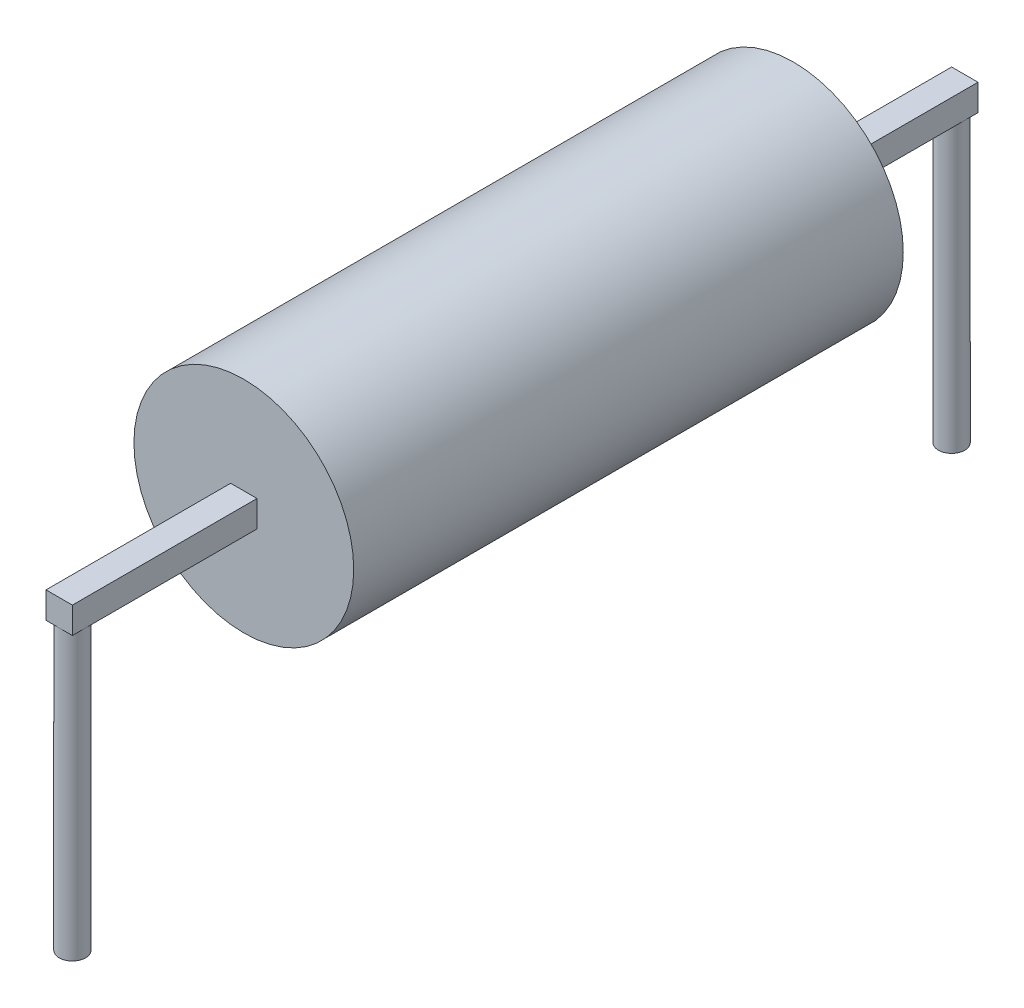
ISO-10303-21;
HEADER;
FILE_DESCRIPTION(('STEP AP214'),'2;1');
FILE_NAME('part.step','',(''),(''),'','','');
FILE_SCHEMA(('AUTOMOTIVE_DESIGN { 1 0 10303 214 1 1 1 1 }'));
ENDSEC;
DATA;
#1=APPLICATION_CONTEXT('core data for automotive mechanical design processes');
#2=APPLICATION_PROTOCOL_DEFINITION('international standard','automotive_design',2000,#1);
#3=PRODUCT_CONTEXT('',#1,'mechanical');
#4=PRODUCT('Part','Part','',(#3));
#5=PRODUCT_RELATED_PRODUCT_CATEGORY('part','',(#4));
#6=PRODUCT_DEFINITION_FORMATION('','',#4);
#7=PRODUCT_DEFINITION_CONTEXT('part definition',#1,'design');
#8=PRODUCT_DEFINITION('design','',#6,#7);
#9=PRODUCT_DEFINITION_SHAPE('','',#8);
#10=(LENGTH_UNIT() NAMED_UNIT(*) SI_UNIT(.MILLI.,.METRE.));
#11=(NAMED_UNIT(*) PLANE_ANGLE_UNIT() SI_UNIT($,.RADIAN.));
#12=(NAMED_UNIT(*) SI_UNIT($,.STERADIAN.) SOLID_ANGLE_UNIT());
#13=UNCERTAINTY_MEASURE_WITH_UNIT(LENGTH_MEASURE(1.E-05),#10,'distance_accuracy_value','');
#14=(GEOMETRIC_REPRESENTATION_CONTEXT(3) GLOBAL_UNCERTAINTY_ASSIGNED_CONTEXT((#13)) GLOBAL_UNIT_ASSIGNED_CONTEXT((#10,
#11,#12)) REPRESENTATION_CONTEXT('',''));
#15=CARTESIAN_POINT('',(0.,0.,0.));
#16=DIRECTION('',(0.,0.,1.));
#17=DIRECTION('',(1.,0.,0.));
#18=AXIS2_PLACEMENT_3D('',#15,#16,#17);
#19=CARTESIAN_POINT('',(-0.299999999999995,-0.3,16.7));
#20=DIRECTION('',(0.,1.,0.));
#21=DIRECTION('',(-1.,0.,0.));
#22=AXIS2_PLACEMENT_3D('',#19,#20,#21);
#23=PLANE('',#22);
#24=CARTESIAN_POINT('',(0.,-0.3,-3.59999999999999));
#25=DIRECTION('',(0.,-1.,0.));
#26=DIRECTION('',(1.,0.,0.));
#27=AXIS2_PLACEMENT_3D('',#24,#25,#26);
#28=CIRCLE('',#27,0.3);
#29=CARTESIAN_POINT('',(-0.299999999999995,-0.3,-3.59999999999999));
#30=VERTEX_POINT('',#29);
#31=CARTESIAN_POINT('',(0.,-0.3,-3.89999999999999));
#32=VERTEX_POINT('',#31);
#33=EDGE_CURVE('E129',#30,#32,#28,.T.);
#34=ORIENTED_EDGE('',*,*,#33,.F.);
#35=DIRECTION('',(0.,0.,-1.));
#36=VECTOR('',#35,1.);
#37=CARTESIAN_POINT('',(-0.299999999999995,-0.3,16.7));
#38=LINE('',#37,#36);
#39=CARTESIAN_POINT('',(-0.299999999999995,-0.3,-3.89999999999999));
#40=VERTEX_POINT('',#39);
#41=EDGE_CURVE('E116',#30,#40,#38,.T.);
#42=ORIENTED_EDGE('',*,*,#41,.T.);
#43=DIRECTION('',(1.,0.,0.));
#44=VECTOR('',#43,1.);
#45=CARTESIAN_POINT('',(-0.299999999999995,-0.3,-3.89999999999999));
#46=LINE('',#45,#44);
#47=EDGE_CURVE('E130',#40,#32,#46,.T.);
#48=ORIENTED_EDGE('',*,*,#47,.T.);
#49=EDGE_LOOP('',(#34,#42,#48));
#50=FACE_BOUND('',#49,.T.);
#51=ADVANCED_FACE('F28',(#50),#23,.F.);
#52=CARTESIAN_POINT('',(0.299999999999995,-0.3,-3.59999999999999));
#53=VERTEX_POINT('',#52);
#54=EDGE_CURVE('E43',#32,#53,#28,.T.);
#55=ORIENTED_EDGE('',*,*,#54,.F.);
#56=CARTESIAN_POINT('',(0.299999999999995,-0.3,-3.89999999999999));
#57=VERTEX_POINT('',#56);
#58=EDGE_CURVE('E147',#32,#57,#46,.T.);
#59=ORIENTED_EDGE('',*,*,#58,.T.);
#60=DIRECTION('',(0.,0.,-1.));
#61=VECTOR('',#60,1.);
#62=CARTESIAN_POINT('',(0.299999999999995,-0.3,16.7));
#63=LINE('',#62,#61);
#64=EDGE_CURVE('E173',#53,#57,#63,.T.);
#65=ORIENTED_EDGE('',*,*,#64,.F.);
#66=EDGE_LOOP('',(#55,#59,#65));
#67=FACE_BOUND('',#66,.T.);
#68=ADVANCED_FACE('F229',(#67),#23,.F.);
#69=EDGE_CURVE('E51',#53,#30,#28,.T.);
#70=ORIENTED_EDGE('',*,*,#69,.F.);
#71=CARTESIAN_POINT('',(0.299999999999995,-0.3,0.));
#72=VERTEX_POINT('',#71);
#73=EDGE_CURVE('E176',#72,#53,#63,.T.);
#74=ORIENTED_EDGE('',*,*,#73,.F.);
#75=DIRECTION('',(-1.,0.,0.));
#76=VECTOR('',#75,1.);
#77=CARTESIAN_POINT('',(0.,-0.3,0.));
#78=LINE('',#77,#76);
#79=CARTESIAN_POINT('',(-0.299999999999995,-0.3,0.));
#80=VERTEX_POINT('',#79);
#81=EDGE_CURVE('E36',#72,#80,#78,.T.);
#82=ORIENTED_EDGE('',*,*,#81,.T.);
#83=EDGE_CURVE('E111',#80,#30,#38,.T.);
#84=ORIENTED_EDGE('',*,*,#83,.T.);
#85=EDGE_LOOP('',(#70,#74,#82,#84));
#86=FACE_BOUND('',#85,.T.);
#87=ADVANCED_FACE('F113',(#86),#23,.F.);
#88=CARTESIAN_POINT('',(0.,-0.3,16.4));
#89=DIRECTION('',(0.,-1.,0.));
#90=DIRECTION('',(1.,0.,0.));
#91=AXIS2_PLACEMENT_3D('',#88,#89,#90);
#92=CIRCLE('',#91,0.3);
#93=CARTESIAN_POINT('',(-0.299999999999995,-0.3,16.4));
#94=VERTEX_POINT('',#93);
#95=CARTESIAN_POINT('',(0.299999999999995,-0.3,16.4));
#96=VERTEX_POINT('',#95);
#97=EDGE_CURVE('E136',#94,#96,#92,.T.);
#98=ORIENTED_EDGE('',*,*,#97,.F.);
#99=CARTESIAN_POINT('',(-0.299999999999995,-0.3,12.5));
#100=VERTEX_POINT('',#99);
#101=EDGE_CURVE('E115',#94,#100,#38,.T.);
#102=ORIENTED_EDGE('',*,*,#101,.T.);
#103=DIRECTION('',(-1.,0.,0.));
#104=VECTOR('',#103,1.);
#105=CARTESIAN_POINT('',(0.,-0.3,12.5));
#106=LINE('',#105,#104);
#107=CARTESIAN_POINT('',(0.299999999999995,-0.3,12.5));
#108=VERTEX_POINT('',#107);
#109=EDGE_CURVE('E184',#108,#100,#106,.T.);
#110=ORIENTED_EDGE('',*,*,#109,.F.);
#111=EDGE_CURVE('E175',#96,#108,#63,.T.);
#112=ORIENTED_EDGE('',*,*,#111,.F.);
#113=EDGE_LOOP('',(#98,#102,#110,#112));
#114=FACE_BOUND('',#113,.T.);
#115=ADVANCED_FACE('F231',(#114),#23,.F.);
#116=CARTESIAN_POINT('',(0.,-0.3,16.7));
#117=VERTEX_POINT('',#116);
#118=EDGE_CURVE('E139',#96,#117,#92,.T.);
#119=ORIENTED_EDGE('',*,*,#118,.F.);
#120=CARTESIAN_POINT('',(0.299999999999995,-0.3,16.7));
#121=VERTEX_POINT('',#120);
#122=EDGE_CURVE('E127',#121,#96,#63,.T.);
#123=ORIENTED_EDGE('',*,*,#122,.F.);
#124=DIRECTION('',(1.,0.,0.));
#125=VECTOR('',#124,1.);
#126=CARTESIAN_POINT('',(-0.299999999999995,-0.3,16.7));
#127=LINE('',#126,#125);
#128=EDGE_CURVE('E158',#117,#121,#127,.T.);
#129=ORIENTED_EDGE('',*,*,#128,.F.);
#130=EDGE_LOOP('',(#119,#123,#129));
#131=FACE_BOUND('',#130,.T.);
#132=ADVANCED_FACE('F237',(#131),#23,.F.);
#133=EDGE_CURVE('E143',#117,#94,#92,.T.);
#134=ORIENTED_EDGE('',*,*,#133,.F.);
#135=CARTESIAN_POINT('',(-0.299999999999995,-0.3,16.7));
#136=VERTEX_POINT('',#135);
#137=EDGE_CURVE('E159',#136,#117,#127,.T.);
#138=ORIENTED_EDGE('',*,*,#137,.F.);
#139=EDGE_CURVE('E118',#136,#94,#38,.T.);
#140=ORIENTED_EDGE('',*,*,#139,.T.);
#141=EDGE_LOOP('',(#134,#138,#140));
#142=FACE_BOUND('',#141,.T.);
#143=ADVANCED_FACE('F224',(#142),#23,.F.);
#144=CARTESIAN_POINT('',(0.,0.,12.5));
#145=DIRECTION('',(0.,0.,1.));
#146=DIRECTION('',(1.,0.,0.));
#147=AXIS2_PLACEMENT_3D('',#144,#145,#146);
#148=PLANE('',#147);
#149=CARTESIAN_POINT('',(0.,0.,12.5));
#150=DIRECTION('',(0.,0.,1.));
#151=DIRECTION('',(1.,0.,0.));
#152=AXIS2_PLACEMENT_3D('',#149,#150,#151);
#153=CIRCLE('',#152,2.5);
#154=CARTESIAN_POINT('',(2.5,0.,12.5));
#155=VERTEX_POINT('',#154);
#156=EDGE_CURVE('E193',#155,#155,#153,.T.);
#157=ORIENTED_EDGE('',*,*,#156,.T.);
#158=EDGE_LOOP('',(#157));
#159=FACE_BOUND('',#158,.T.);
#160=ORIENTED_EDGE('',*,*,#109,.T.);
#161=DIRECTION('',(0.,1.,0.));
#162=VECTOR('',#161,1.);
#163=CARTESIAN_POINT('',(-0.299999999999995,0.,12.5));
#164=LINE('',#163,#162);
#165=CARTESIAN_POINT('',(-0.299999999999995,0.3,12.5));
#166=VERTEX_POINT('',#165);
#167=EDGE_CURVE('E187',#100,#166,#164,.T.);
#168=ORIENTED_EDGE('',*,*,#167,.T.);
#169=DIRECTION('',(1.,0.,0.));
#170=VECTOR('',#169,1.);
#171=CARTESIAN_POINT('',(0.,0.3,12.5));
#172=LINE('',#171,#170);
#173=CARTESIAN_POINT('',(0.299999999999995,0.3,12.5));
#174=VERTEX_POINT('',#173);
#175=EDGE_CURVE('E178',#166,#174,#172,.T.);
#176=ORIENTED_EDGE('',*,*,#175,.T.);
#177=DIRECTION('',(0.,-1.,0.));
#178=VECTOR('',#177,1.);
#179=CARTESIAN_POINT('',(0.299999999999995,0.,12.5));
#180=LINE('',#179,#178);
#181=EDGE_CURVE('E181',#174,#108,#180,.T.);
#182=ORIENTED_EDGE('',*,*,#181,.T.);
#183=EDGE_LOOP('',(#160,#168,#176,#182));
#184=FACE_BOUND('',#183,.T.);
#185=ADVANCED_FACE('F216',(#159,#184),#148,.T.);
#186=CARTESIAN_POINT('',(0.,0.,0.));
#187=DIRECTION('',(0.,0.,1.));
#188=DIRECTION('',(1.,0.,0.));
#189=AXIS2_PLACEMENT_3D('',#186,#187,#188);
#190=PLANE('',#189);
#191=CARTESIAN_POINT('',(0.,0.,0.));
#192=DIRECTION('',(0.,0.,1.));
#193=DIRECTION('',(1.,0.,0.));
#194=AXIS2_PLACEMENT_3D('',#191,#192,#193);
#195=CIRCLE('',#194,2.5);
#196=CARTESIAN_POINT('',(2.5,0.,0.));
#197=VERTEX_POINT('',#196);
#198=EDGE_CURVE('E190',#197,#197,#195,.T.);
#199=ORIENTED_EDGE('',*,*,#198,.F.);
#200=EDGE_LOOP('',(#199));
#201=FACE_BOUND('',#200,.T.);
#202=DIRECTION('',(0.,1.,0.));
#203=VECTOR('',#202,1.);
#204=CARTESIAN_POINT('',(-0.299999999999995,0.,0.));
#205=LINE('',#204,#203);
#206=CARTESIAN_POINT('',(-0.299999999999995,0.3,0.));
#207=VERTEX_POINT('',#206);
#208=EDGE_CURVE('E11',#80,#207,#205,.T.);
#209=ORIENTED_EDGE('',*,*,#208,.F.);
#210=ORIENTED_EDGE('',*,*,#81,.F.);
#211=DIRECTION('',(0.,-1.,0.));
#212=VECTOR('',#211,1.);
#213=CARTESIAN_POINT('',(0.299999999999995,0.,0.));
#214=LINE('',#213,#212);
#215=CARTESIAN_POINT('',(0.299999999999995,0.3,0.));
#216=VERTEX_POINT('',#215);
#217=EDGE_CURVE('E199',#216,#72,#214,.T.);
#218=ORIENTED_EDGE('',*,*,#217,.F.);
#219=DIRECTION('',(1.,0.,0.));
#220=VECTOR('',#219,1.);
#221=CARTESIAN_POINT('',(0.,0.3,0.));
#222=LINE('',#221,#220);
#223=EDGE_CURVE('E196',#207,#216,#222,.T.);
#224=ORIENTED_EDGE('',*,*,#223,.F.);
#225=EDGE_LOOP('',(#209,#210,#218,#224));
#226=FACE_BOUND('',#225,.T.);
#227=ADVANCED_FACE('F214',(#201,#226),#190,.F.);
#228=CARTESIAN_POINT('',(0.,0.,12.5));
#229=DIRECTION('',(0.,0.,-1.));
#230=DIRECTION('',(-1.,0.,0.));
#231=AXIS2_PLACEMENT_3D('',#228,#229,#230);
#232=CYLINDRICAL_SURFACE('',#231,2.5);
#233=ORIENTED_EDGE('',*,*,#156,.F.);
#234=EDGE_LOOP('',(#233));
#235=FACE_BOUND('',#234,.T.);
#236=ORIENTED_EDGE('',*,*,#198,.T.);
#237=EDGE_LOOP('',(#236));
#238=FACE_BOUND('',#237,.T.);
#239=ADVANCED_FACE('F30',(#235,#238),#232,.T.);
#240=CARTESIAN_POINT('',(-0.299999999999995,0.3,-3.89999999999999));
#241=DIRECTION('',(0.,0.,-1.));
#242=DIRECTION('',(-1.,0.,0.));
#243=AXIS2_PLACEMENT_3D('',#240,#241,#242);
#244=PLANE('',#243);
#245=DIRECTION('',(0.,-1.,0.));
#246=VECTOR('',#245,1.);
#247=CARTESIAN_POINT('',(-0.299999999999995,-0.3,-3.89999999999999));
#248=LINE('',#247,#246);
#249=CARTESIAN_POINT('',(-0.299999999999995,0.3,-3.89999999999999));
#250=VERTEX_POINT('',#249);
#251=EDGE_CURVE('E123',#250,#40,#248,.T.);
#252=ORIENTED_EDGE('',*,*,#251,.F.);
#253=DIRECTION('',(-1.,0.,0.));
#254=VECTOR('',#253,1.);
#255=CARTESIAN_POINT('',(-0.299999999999995,0.3,-3.89999999999999));
#256=LINE('',#255,#254);
#257=CARTESIAN_POINT('',(0.299999999999995,0.3,-3.89999999999999));
#258=VERTEX_POINT('',#257);
#259=EDGE_CURVE('E152',#258,#250,#256,.T.);
#260=ORIENTED_EDGE('',*,*,#259,.F.);
#261=DIRECTION('',(0.,1.,0.));
#262=VECTOR('',#261,1.);
#263=CARTESIAN_POINT('',(0.299999999999995,-0.3,-3.89999999999999));
#264=LINE('',#263,#262);
#265=EDGE_CURVE('E149',#57,#258,#264,.T.);
#266=ORIENTED_EDGE('',*,*,#265,.F.);
#267=ORIENTED_EDGE('',*,*,#58,.F.);
#268=ORIENTED_EDGE('',*,*,#47,.F.);
#269=EDGE_LOOP('',(#252,#260,#266,#267,#268));
#270=FACE_BOUND('',#269,.T.);
#271=ADVANCED_FACE('F210',(#270),#244,.T.);
#272=CARTESIAN_POINT('',(-0.299999999999995,0.3,16.7));
#273=DIRECTION('',(0.,-1.,0.));
#274=DIRECTION('',(1.,0.,0.));
#275=AXIS2_PLACEMENT_3D('',#272,#273,#274);
#276=PLANE('',#275);
#277=DIRECTION('',(0.,0.,-1.));
#278=VECTOR('',#277,1.);
#279=CARTESIAN_POINT('',(-0.299999999999995,0.3,16.7));
#280=LINE('',#279,#278);
#281=EDGE_CURVE('E166',#207,#250,#280,.T.);
#282=ORIENTED_EDGE('',*,*,#281,.F.);
#283=ORIENTED_EDGE('',*,*,#223,.T.);
#284=DIRECTION('',(0.,0.,-1.));
#285=VECTOR('',#284,1.);
#286=CARTESIAN_POINT('',(0.299999999999995,0.3,16.7));
#287=LINE('',#286,#285);
#288=EDGE_CURVE('E170',#216,#258,#287,.T.);
#289=ORIENTED_EDGE('',*,*,#288,.T.);
#290=ORIENTED_EDGE('',*,*,#259,.T.);
#291=EDGE_LOOP('',(#282,#283,#289,#290));
#292=FACE_BOUND('',#291,.T.);
#293=ADVANCED_FACE('F213',(#292),#276,.F.);
#294=CARTESIAN_POINT('',(0.299999999999995,-0.3,16.7));
#295=DIRECTION('',(-1.,0.,0.));
#296=DIRECTION('',(0.,0.,1.));
#297=AXIS2_PLACEMENT_3D('',#294,#295,#296);
#298=PLANE('',#297);
#299=ORIENTED_EDGE('',*,*,#288,.F.);
#300=ORIENTED_EDGE('',*,*,#217,.T.);
#301=ORIENTED_EDGE('',*,*,#73,.T.);
#302=ORIENTED_EDGE('',*,*,#64,.T.);
#303=ORIENTED_EDGE('',*,*,#265,.T.);
#304=EDGE_LOOP('',(#299,#300,#301,#302,#303));
#305=FACE_BOUND('',#304,.T.);
#306=ADVANCED_FACE('F204',(#305),#298,.F.);
#307=CARTESIAN_POINT('',(-0.299999999999995,-0.3,16.7));
#308=DIRECTION('',(1.,0.,0.));
#309=DIRECTION('',(0.,1.,0.));
#310=AXIS2_PLACEMENT_3D('',#307,#308,#309);
#311=PLANE('',#310);
#312=ORIENTED_EDGE('',*,*,#83,.F.);
#313=ORIENTED_EDGE('',*,*,#208,.T.);
#314=ORIENTED_EDGE('',*,*,#281,.T.);
#315=ORIENTED_EDGE('',*,*,#251,.T.);
#316=ORIENTED_EDGE('',*,*,#41,.F.);
#317=EDGE_LOOP('',(#312,#313,#314,#315,#316));
#318=FACE_BOUND('',#317,.T.);
#319=ADVANCED_FACE('F121',(#318),#311,.F.);
#320=ORIENTED_EDGE('',*,*,#167,.F.);
#321=ORIENTED_EDGE('',*,*,#101,.F.);
#322=ORIENTED_EDGE('',*,*,#139,.F.);
#323=DIRECTION('',(0.,-1.,0.));
#324=VECTOR('',#323,1.);
#325=CARTESIAN_POINT('',(-0.299999999999995,-0.3,16.7));
#326=LINE('',#325,#324);
#327=CARTESIAN_POINT('',(-0.299999999999995,0.3,16.7));
#328=VERTEX_POINT('',#327);
#329=EDGE_CURVE('E155',#328,#136,#326,.T.);
#330=ORIENTED_EDGE('',*,*,#329,.F.);
#331=EDGE_CURVE('E167',#328,#166,#280,.T.);
#332=ORIENTED_EDGE('',*,*,#331,.T.);
#333=EDGE_LOOP('',(#320,#321,#322,#330,#332));
#334=FACE_BOUND('',#333,.T.);
#335=ADVANCED_FACE('F273',(#334),#311,.F.);
#336=ORIENTED_EDGE('',*,*,#181,.F.);
#337=CARTESIAN_POINT('',(0.299999999999995,0.3,16.7));
#338=VERTEX_POINT('',#337);
#339=EDGE_CURVE('E171',#338,#174,#287,.T.);
#340=ORIENTED_EDGE('',*,*,#339,.F.);
#341=DIRECTION('',(0.,1.,0.));
#342=VECTOR('',#341,1.);
#343=CARTESIAN_POINT('',(0.299999999999995,-0.3,16.7));
#344=LINE('',#343,#342);
#345=EDGE_CURVE('E162',#121,#338,#344,.T.);
#346=ORIENTED_EDGE('',*,*,#345,.F.);
#347=ORIENTED_EDGE('',*,*,#122,.T.);
#348=ORIENTED_EDGE('',*,*,#111,.T.);
#349=EDGE_LOOP('',(#336,#340,#346,#347,#348));
#350=FACE_BOUND('',#349,.T.);
#351=ADVANCED_FACE('F266',(#350),#298,.F.);
#352=ORIENTED_EDGE('',*,*,#175,.F.);
#353=ORIENTED_EDGE('',*,*,#331,.F.);
#354=DIRECTION('',(-1.,0.,0.));
#355=VECTOR('',#354,1.);
#356=CARTESIAN_POINT('',(-0.299999999999995,0.3,16.7));
#357=LINE('',#356,#355);
#358=EDGE_CURVE('E164',#338,#328,#357,.T.);
#359=ORIENTED_EDGE('',*,*,#358,.F.);
#360=ORIENTED_EDGE('',*,*,#339,.T.);
#361=EDGE_LOOP('',(#352,#353,#359,#360));
#362=FACE_BOUND('',#361,.T.);
#363=ADVANCED_FACE('F271',(#362),#276,.F.);
#364=CARTESIAN_POINT('',(-0.299999999999995,0.3,16.7));
#365=DIRECTION('',(0.,0.,-1.));
#366=DIRECTION('',(-1.,0.,0.));
#367=AXIS2_PLACEMENT_3D('',#364,#365,#366);
#368=PLANE('',#367);
#369=ORIENTED_EDGE('',*,*,#329,.T.);
#370=ORIENTED_EDGE('',*,*,#137,.T.);
#371=ORIENTED_EDGE('',*,*,#128,.T.);
#372=ORIENTED_EDGE('',*,*,#345,.T.);
#373=ORIENTED_EDGE('',*,*,#358,.T.);
#374=EDGE_LOOP('',(#369,#370,#371,#372,#373));
#375=FACE_BOUND('',#374,.T.);
#376=ADVANCED_FACE('F259',(#375),#368,.F.);
#377=CARTESIAN_POINT('',(0.,-6.8,16.4));
#378=DIRECTION('',(0.,1.,0.));
#379=DIRECTION('',(-1.,0.,0.));
#380=AXIS2_PLACEMENT_3D('',#377,#378,#379);
#381=CYLINDRICAL_SURFACE('',#380,0.3);
#382=CARTESIAN_POINT('',(0.,-6.8,16.4));
#383=DIRECTION('',(0.,-1.,0.));
#384=DIRECTION('',(1.,0.,0.));
#385=AXIS2_PLACEMENT_3D('',#382,#383,#384);
#386=CIRCLE('',#385,0.3);
#387=CARTESIAN_POINT('',(0.3,-6.8,16.4));
#388=VERTEX_POINT('',#387);
#389=EDGE_CURVE('E142',#388,#388,#386,.T.);
#390=ORIENTED_EDGE('',*,*,#389,.F.);
#391=EDGE_LOOP('',(#390));
#392=FACE_BOUND('',#391,.T.);
#393=ORIENTED_EDGE('',*,*,#118,.T.);
#394=ORIENTED_EDGE('',*,*,#133,.T.);
#395=ORIENTED_EDGE('',*,*,#97,.T.);
#396=EDGE_LOOP('',(#393,#394,#395));
#397=FACE_BOUND('',#396,.T.);
#398=ADVANCED_FACE('F261',(#392,#397),#381,.T.);
#399=CARTESIAN_POINT('',(0.,-6.8,16.4));
#400=DIRECTION('',(0.,-1.,0.));
#401=DIRECTION('',(1.,0.,0.));
#402=AXIS2_PLACEMENT_3D('',#399,#400,#401);
#403=PLANE('',#402);
#404=ORIENTED_EDGE('',*,*,#389,.T.);
#405=EDGE_LOOP('',(#404));
#406=FACE_BOUND('',#405,.T.);
#407=ADVANCED_FACE('F295',(#406),#403,.T.);
#408=CARTESIAN_POINT('',(0.,-6.8,-3.59999999999999));
#409=DIRECTION('',(0.,1.,0.));
#410=DIRECTION('',(-1.,0.,0.));
#411=AXIS2_PLACEMENT_3D('',#408,#409,#410);
#412=CYLINDRICAL_SURFACE('',#411,0.3);
#413=CARTESIAN_POINT('',(0.,-6.8,-3.59999999999999));
#414=DIRECTION('',(0.,-1.,0.));
#415=DIRECTION('',(1.,0.,0.));
#416=AXIS2_PLACEMENT_3D('',#413,#414,#415);
#417=CIRCLE('',#416,0.3);
#418=CARTESIAN_POINT('',(0.3,-6.8,-3.59999999999999));
#419=VERTEX_POINT('',#418);
#420=EDGE_CURVE('E134',#419,#419,#417,.T.);
#421=ORIENTED_EDGE('',*,*,#420,.F.);
#422=EDGE_LOOP('',(#421));
#423=FACE_BOUND('',#422,.T.);
#424=ORIENTED_EDGE('',*,*,#69,.T.);
#425=ORIENTED_EDGE('',*,*,#33,.T.);
#426=ORIENTED_EDGE('',*,*,#54,.T.);
#427=EDGE_LOOP('',(#424,#425,#426));
#428=FACE_BOUND('',#427,.T.);
#429=ADVANCED_FACE('F133',(#423,#428),#412,.T.);
#430=CARTESIAN_POINT('',(0.,-6.8,-3.59999999999999));
#431=DIRECTION('',(0.,-1.,0.));
#432=DIRECTION('',(1.,0.,0.));
#433=AXIS2_PLACEMENT_3D('',#430,#431,#432);
#434=PLANE('',#433);
#435=ORIENTED_EDGE('',*,*,#420,.T.);
#436=EDGE_LOOP('',(#435));
#437=FACE_BOUND('',#436,.T.);
#438=ADVANCED_FACE('F302',(#437),#434,.T.);
#439=CLOSED_SHELL('',(#51,#68,#87,#115,#132,#143,#185,#227,#239,#271,#293,#306,#319,#335,#351,
#363,#376,#398,#407,#429,#438));
#440=MANIFOLD_SOLID_BREP('B2',#439);
#441=ADVANCED_BREP_SHAPE_REPRESENTATION('',(#18,#440),#14);
#442=SHAPE_DEFINITION_REPRESENTATION(#9,#441);
ENDSEC;
END-ISO-10303-21;
